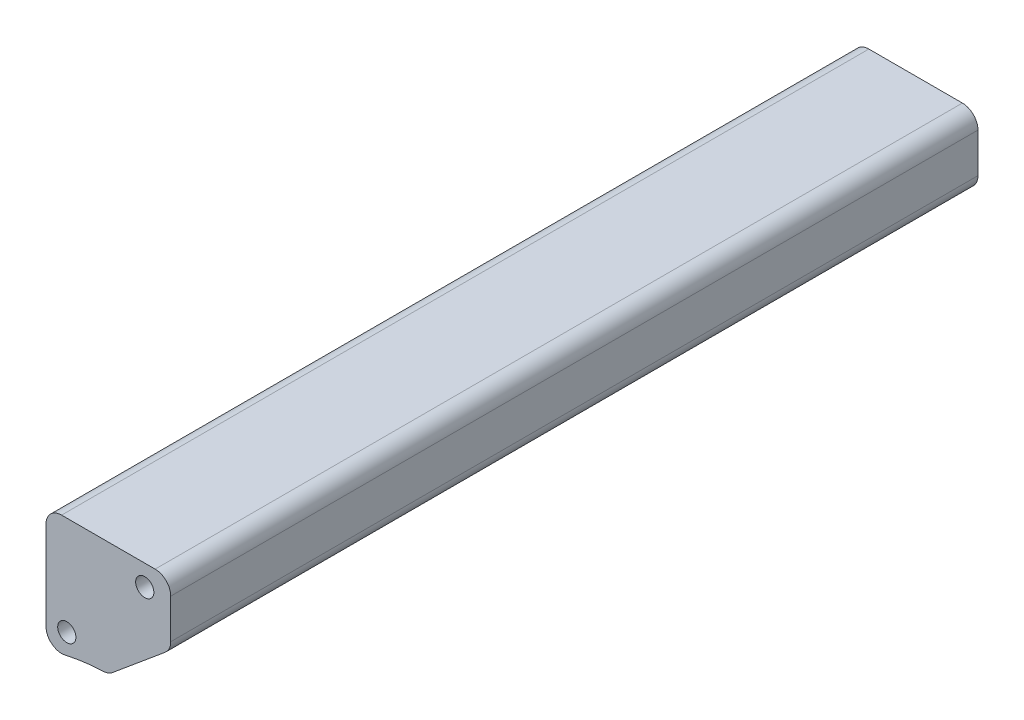
ISO-10303-21;
HEADER;
FILE_DESCRIPTION(('STEP AP214'),'2;1');
FILE_NAME('part.step','',(''),(''),'','','');
FILE_SCHEMA(('AUTOMOTIVE_DESIGN { 1 0 10303 214 1 1 1 1 }'));
ENDSEC;
DATA;
#1=APPLICATION_CONTEXT('core data for automotive mechanical design processes');
#2=APPLICATION_PROTOCOL_DEFINITION('international standard','automotive_design',2000,#1);
#3=PRODUCT_CONTEXT('',#1,'mechanical');
#4=PRODUCT('Part','Part','',(#3));
#5=PRODUCT_RELATED_PRODUCT_CATEGORY('part','',(#4));
#6=PRODUCT_DEFINITION_FORMATION('','',#4);
#7=PRODUCT_DEFINITION_CONTEXT('part definition',#1,'design');
#8=PRODUCT_DEFINITION('design','',#6,#7);
#9=PRODUCT_DEFINITION_SHAPE('','',#8);
#10=(LENGTH_UNIT() NAMED_UNIT(*) SI_UNIT(.MILLI.,.METRE.));
#11=(NAMED_UNIT(*) PLANE_ANGLE_UNIT() SI_UNIT($,.RADIAN.));
#12=(NAMED_UNIT(*) SI_UNIT($,.STERADIAN.) SOLID_ANGLE_UNIT());
#13=UNCERTAINTY_MEASURE_WITH_UNIT(LENGTH_MEASURE(1.E-05),#10,'distance_accuracy_value','');
#14=(GEOMETRIC_REPRESENTATION_CONTEXT(3) GLOBAL_UNCERTAINTY_ASSIGNED_CONTEXT((#13)) GLOBAL_UNIT_ASSIGNED_CONTEXT((#10,
#11,#12)) REPRESENTATION_CONTEXT('',''));
#15=CARTESIAN_POINT('',(0.,0.,0.));
#16=DIRECTION('',(0.,0.,1.));
#17=DIRECTION('',(1.,0.,0.));
#18=AXIS2_PLACEMENT_3D('',#15,#16,#17);
#19=CARTESIAN_POINT('',(6.2449979983984,-19.,77.66));
#20=DIRECTION('',(0.,0.,-1.));
#21=DIRECTION('',(-1.,0.,0.));
#22=AXIS2_PLACEMENT_3D('',#19,#20,#21);
#23=CYLINDRICAL_SURFACE('',#22,20.);
#24=CARTESIAN_POINT('',(6.2449979983984,-19.,0.));
#25=DIRECTION('',(0.,0.,-1.));
#26=DIRECTION('',(-1.,0.,0.));
#27=AXIS2_PLACEMENT_3D('',#24,#25,#26);
#28=CIRCLE('',#27,20.);
#29=CARTESIAN_POINT('',(1.83104637198128,0.506845748086741,0.));
#30=VERTEX_POINT('',#29);
#31=CARTESIAN_POINT('',(5.49666416086263,0.98599500819509,0.));
#32=VERTEX_POINT('',#31);
#33=EDGE_CURVE('E158',#30,#32,#28,.T.);
#34=ORIENTED_EDGE('',*,*,#33,.T.);
#35=DIRECTION('',(0.,0.,-1.));
#36=VECTOR('',#35,1.);
#37=CARTESIAN_POINT('',(5.49666416086263,0.98599500819509,77.66));
#38=LINE('',#37,#36);
#39=CARTESIAN_POINT('',(5.49666416086263,0.98599500819509,77.66));
#40=VERTEX_POINT('',#39);
#41=EDGE_CURVE('E203',#32,#40,#38,.F.);
#42=ORIENTED_EDGE('',*,*,#41,.T.);
#43=CARTESIAN_POINT('',(6.2449979983984,-19.,77.66));
#44=DIRECTION('',(0.,0.,-1.));
#45=DIRECTION('',(-1.,0.,0.));
#46=AXIS2_PLACEMENT_3D('',#43,#44,#45);
#47=CIRCLE('',#46,20.);
#48=CARTESIAN_POINT('',(1.83104637198128,0.506845748086741,77.66));
#49=VERTEX_POINT('',#48);
#50=EDGE_CURVE('E159',#49,#40,#47,.T.);
#51=ORIENTED_EDGE('',*,*,#50,.F.);
#52=DIRECTION('',(0.,0.,-1.));
#53=VECTOR('',#52,1.);
#54=CARTESIAN_POINT('',(1.83104637198128,0.506845748086741,77.66));
#55=LINE('',#54,#53);
#56=EDGE_CURVE('E200',#49,#30,#55,.T.);
#57=ORIENTED_EDGE('',*,*,#56,.T.);
#58=EDGE_LOOP('',(#34,#42,#51,#57));
#59=FACE_BOUND('',#58,.T.);
#60=ADVANCED_FACE('F38',(#59),#23,.F.);
#61=CARTESIAN_POINT('',(12.,6.,77.66));
#62=DIRECTION('',(-0.64029777249604,0.768126788060806,0.));
#63=DIRECTION('',(-0.768126788060806,-0.64029777249604,0.));
#64=AXIS2_PLACEMENT_3D('',#61,#62,#63);
#65=PLANE('',#64);
#66=DIRECTION('',(0.768126788060806,0.64029777249604,0.));
#67=VECTOR('',#66,1.);
#68=CARTESIAN_POINT('',(12.,6.,77.66));
#69=LINE('',#68,#67);
#70=CARTESIAN_POINT('',(6.40098578179151,1.33275445171851,77.66));
#71=VERTEX_POINT('',#70);
#72=CARTESIAN_POINT('',(11.4604466587441,5.55023726822345,77.66));
#73=VERTEX_POINT('',#72);
#74=EDGE_CURVE('E162',#71,#73,#69,.T.);
#75=ORIENTED_EDGE('',*,*,#74,.F.);
#76=DIRECTION('',(0.,0.,-1.));
#77=VECTOR('',#76,1.);
#78=CARTESIAN_POINT('',(6.40098578179151,1.33275445171851,77.66));
#79=LINE('',#78,#77);
#80=CARTESIAN_POINT('',(6.40098578179151,1.33275445171851,0.));
#81=VERTEX_POINT('',#80);
#82=EDGE_CURVE('E187',#71,#81,#79,.T.);
#83=ORIENTED_EDGE('',*,*,#82,.T.);
#84=DIRECTION('',(0.768126788060806,0.64029777249604,0.));
#85=VECTOR('',#84,1.);
#86=CARTESIAN_POINT('',(12.,6.,0.));
#87=LINE('',#86,#85);
#88=CARTESIAN_POINT('',(11.4604466587441,5.55023726822345,0.));
#89=VERTEX_POINT('',#88);
#90=EDGE_CURVE('E176',#81,#89,#87,.T.);
#91=ORIENTED_EDGE('',*,*,#90,.T.);
#92=DIRECTION('',(0.,0.,-1.));
#93=VECTOR('',#92,1.);
#94=CARTESIAN_POINT('',(11.4604466587441,5.55023726822345,77.66));
#95=LINE('',#94,#93);
#96=EDGE_CURVE('E173',#89,#73,#95,.F.);
#97=ORIENTED_EDGE('',*,*,#96,.T.);
#98=EDGE_LOOP('',(#75,#83,#91,#97));
#99=FACE_BOUND('',#98,.T.);
#100=ADVANCED_FACE('F247',(#99),#65,.F.);
#101=CARTESIAN_POINT('',(12.,12.,77.66));
#102=DIRECTION('',(-1.,0.,0.));
#103=DIRECTION('',(0.,-1.,0.));
#104=AXIS2_PLACEMENT_3D('',#101,#102,#103);
#105=PLANE('',#104);
#106=DIRECTION('',(0.,1.,0.));
#107=VECTOR('',#106,1.);
#108=CARTESIAN_POINT('',(12.,12.,77.66));
#109=LINE('',#108,#107);
#110=CARTESIAN_POINT('',(12.,6.70242745031466,77.66));
#111=VERTEX_POINT('',#110);
#112=CARTESIAN_POINT('',(12.,10.5,77.66));
#113=VERTEX_POINT('',#112);
#114=EDGE_CURVE('E166',#111,#113,#109,.T.);
#115=ORIENTED_EDGE('',*,*,#114,.F.);
#116=DIRECTION('',(0.,0.,-1.));
#117=VECTOR('',#116,1.);
#118=CARTESIAN_POINT('',(12.,6.70242745031466,77.66));
#119=LINE('',#118,#117);
#120=CARTESIAN_POINT('',(12.,6.70242745031466,0.));
#121=VERTEX_POINT('',#120);
#122=EDGE_CURVE('E216',#111,#121,#119,.T.);
#123=ORIENTED_EDGE('',*,*,#122,.T.);
#124=DIRECTION('',(0.,1.,0.));
#125=VECTOR('',#124,1.);
#126=CARTESIAN_POINT('',(12.,12.,0.));
#127=LINE('',#126,#125);
#128=CARTESIAN_POINT('',(12.,10.5,0.));
#129=VERTEX_POINT('',#128);
#130=EDGE_CURVE('E179',#121,#129,#127,.T.);
#131=ORIENTED_EDGE('',*,*,#130,.T.);
#132=DIRECTION('',(0.,0.,-1.));
#133=VECTOR('',#132,1.);
#134=CARTESIAN_POINT('',(12.,10.5,77.66));
#135=LINE('',#134,#133);
#136=EDGE_CURVE('E214',#129,#113,#135,.F.);
#137=ORIENTED_EDGE('',*,*,#136,.T.);
#138=EDGE_LOOP('',(#115,#123,#131,#137));
#139=FACE_BOUND('',#138,.T.);
#140=ADVANCED_FACE('F256',(#139),#105,.F.);
#141=CARTESIAN_POINT('',(0.,12.,77.66));
#142=DIRECTION('',(0.,-1.,0.));
#143=DIRECTION('',(0.,0.,-1.));
#144=AXIS2_PLACEMENT_3D('',#141,#142,#143);
#145=PLANE('',#144);
#146=DIRECTION('',(-1.,0.,0.));
#147=VECTOR('',#146,1.);
#148=CARTESIAN_POINT('',(0.,12.,77.66));
#149=LINE('',#148,#147);
#150=CARTESIAN_POINT('',(10.5,12.,77.66));
#151=VERTEX_POINT('',#150);
#152=CARTESIAN_POINT('',(1.5,12.,77.66));
#153=VERTEX_POINT('',#152);
#154=EDGE_CURVE('E169',#151,#153,#149,.T.);
#155=ORIENTED_EDGE('',*,*,#154,.F.);
#156=DIRECTION('',(0.,0.,-1.));
#157=VECTOR('',#156,1.);
#158=CARTESIAN_POINT('',(10.5,12.,77.66));
#159=LINE('',#158,#157);
#160=CARTESIAN_POINT('',(10.5,12.,0.));
#161=VERTEX_POINT('',#160);
#162=EDGE_CURVE('E221',#151,#161,#159,.T.);
#163=ORIENTED_EDGE('',*,*,#162,.T.);
#164=DIRECTION('',(-1.,0.,0.));
#165=VECTOR('',#164,1.);
#166=CARTESIAN_POINT('',(0.,12.,0.));
#167=LINE('',#166,#165);
#168=CARTESIAN_POINT('',(1.5,12.,0.));
#169=VERTEX_POINT('',#168);
#170=EDGE_CURVE('E182',#161,#169,#167,.T.);
#171=ORIENTED_EDGE('',*,*,#170,.T.);
#172=DIRECTION('',(0.,0.,-1.));
#173=VECTOR('',#172,1.);
#174=CARTESIAN_POINT('',(1.5,12.,77.66));
#175=LINE('',#174,#173);
#176=EDGE_CURVE('E219',#169,#153,#175,.F.);
#177=ORIENTED_EDGE('',*,*,#176,.T.);
#178=EDGE_LOOP('',(#155,#163,#171,#177));
#179=FACE_BOUND('',#178,.T.);
#180=ADVANCED_FACE('F264',(#179),#145,.F.);
#181=CARTESIAN_POINT('',(0.,0.,77.66));
#182=DIRECTION('',(1.,0.,0.));
#183=DIRECTION('',(0.,0.,-1.));
#184=AXIS2_PLACEMENT_3D('',#181,#182,#183);
#185=PLANE('',#184);
#186=DIRECTION('',(0.,-1.,0.));
#187=VECTOR('',#186,1.);
#188=CARTESIAN_POINT('',(0.,0.,0.));
#189=LINE('',#188,#187);
#190=CARTESIAN_POINT('',(0.,10.5,0.));
#191=VERTEX_POINT('',#190);
#192=CARTESIAN_POINT('',(0.,1.96985917919325,0.));
#193=VERTEX_POINT('',#192);
#194=EDGE_CURVE('E163',#191,#193,#189,.T.);
#195=ORIENTED_EDGE('',*,*,#194,.T.);
#196=DIRECTION('',(0.,0.,-1.));
#197=VECTOR('',#196,1.);
#198=CARTESIAN_POINT('',(0.,1.96985917919325,77.66));
#199=LINE('',#198,#197);
#200=CARTESIAN_POINT('',(0.,1.96985917919325,77.66));
#201=VERTEX_POINT('',#200);
#202=EDGE_CURVE('E11',#193,#201,#199,.F.);
#203=ORIENTED_EDGE('',*,*,#202,.T.);
#204=DIRECTION('',(0.,-1.,0.));
#205=VECTOR('',#204,1.);
#206=CARTESIAN_POINT('',(0.,0.,77.66));
#207=LINE('',#206,#205);
#208=CARTESIAN_POINT('',(0.,10.5,77.66));
#209=VERTEX_POINT('',#208);
#210=EDGE_CURVE('E171',#209,#201,#207,.T.);
#211=ORIENTED_EDGE('',*,*,#210,.F.);
#212=DIRECTION('',(0.,0.,-1.));
#213=VECTOR('',#212,1.);
#214=CARTESIAN_POINT('',(0.,10.5,77.66));
#215=LINE('',#214,#213);
#216=EDGE_CURVE('E46',#209,#191,#215,.T.);
#217=ORIENTED_EDGE('',*,*,#216,.T.);
#218=EDGE_LOOP('',(#195,#203,#211,#217));
#219=FACE_BOUND('',#218,.T.);
#220=ADVANCED_FACE('F226',(#219),#185,.F.);
#221=CARTESIAN_POINT('',(6.2449979983984,-19.,77.66));
#222=DIRECTION('',(0.,0.,-1.));
#223=DIRECTION('',(-1.,0.,0.));
#224=AXIS2_PLACEMENT_3D('',#221,#222,#223);
#225=PLANE('',#224);
#226=CARTESIAN_POINT('',(2.,2.5,77.66));
#227=DIRECTION('',(0.,0.,1.));
#228=DIRECTION('',(1.,0.,0.));
#229=AXIS2_PLACEMENT_3D('',#226,#227,#228);
#230=CIRCLE('',#229,0.874999999999999);
#231=CARTESIAN_POINT('',(2.875,2.5,77.66));
#232=VERTEX_POINT('',#231);
#233=EDGE_CURVE('E136',#232,#232,#230,.T.);
#234=ORIENTED_EDGE('',*,*,#233,.F.);
#235=EDGE_LOOP('',(#234));
#236=FACE_BOUND('',#235,.T.);
#237=CARTESIAN_POINT('',(9.5,10.,77.66));
#238=DIRECTION('',(0.,0.,1.));
#239=DIRECTION('',(1.,0.,0.));
#240=AXIS2_PLACEMENT_3D('',#237,#238,#239);
#241=CIRCLE('',#240,0.874999999999999);
#242=CARTESIAN_POINT('',(10.375,10.,77.66));
#243=VERTEX_POINT('',#242);
#244=EDGE_CURVE('E135',#243,#243,#241,.T.);
#245=ORIENTED_EDGE('',*,*,#244,.F.);
#246=EDGE_LOOP('',(#245));
#247=FACE_BOUND('',#246,.T.);
#248=ORIENTED_EDGE('',*,*,#50,.T.);
#249=CARTESIAN_POINT('',(5.44053912304745,2.48494463380972,77.66));
#250=DIRECTION('',(0.,0.,-1.));
#251=DIRECTION('',(-1.,0.,0.));
#252=AXIS2_PLACEMENT_3D('',#249,#250,#251);
#253=CIRCLE('',#252,1.5);
#254=EDGE_CURVE('E212',#40,#71,#253,.F.);
#255=ORIENTED_EDGE('',*,*,#254,.T.);
#256=ORIENTED_EDGE('',*,*,#74,.T.);
#257=CARTESIAN_POINT('',(10.5,6.70242745031466,77.66));
#258=DIRECTION('',(0.,0.,-1.));
#259=DIRECTION('',(-1.,0.,0.));
#260=AXIS2_PLACEMENT_3D('',#257,#258,#259);
#261=CIRCLE('',#260,1.5);
#262=EDGE_CURVE('E210',#73,#111,#261,.F.);
#263=ORIENTED_EDGE('',*,*,#262,.T.);
#264=ORIENTED_EDGE('',*,*,#114,.T.);
#265=CARTESIAN_POINT('',(10.5,10.5,77.66));
#266=DIRECTION('',(0.,0.,-1.));
#267=DIRECTION('',(-1.,0.,0.));
#268=AXIS2_PLACEMENT_3D('',#265,#266,#267);
#269=CIRCLE('',#268,1.5);
#270=EDGE_CURVE('E208',#113,#151,#269,.F.);
#271=ORIENTED_EDGE('',*,*,#270,.T.);
#272=ORIENTED_EDGE('',*,*,#154,.T.);
#273=CARTESIAN_POINT('',(1.5,10.5,77.66));
#274=DIRECTION('',(0.,0.,-1.));
#275=DIRECTION('',(-1.,0.,0.));
#276=AXIS2_PLACEMENT_3D('',#273,#274,#275);
#277=CIRCLE('',#276,1.5);
#278=EDGE_CURVE('E58',#153,#209,#277,.F.);
#279=ORIENTED_EDGE('',*,*,#278,.T.);
#280=ORIENTED_EDGE('',*,*,#210,.T.);
#281=CARTESIAN_POINT('',(1.5,1.96985917919325,77.66));
#282=DIRECTION('',(0.,0.,-1.));
#283=DIRECTION('',(-1.,0.,0.));
#284=AXIS2_PLACEMENT_3D('',#281,#282,#283);
#285=CIRCLE('',#284,1.5);
#286=EDGE_CURVE('E206',#201,#49,#285,.F.);
#287=ORIENTED_EDGE('',*,*,#286,.T.);
#288=EDGE_LOOP('',(#248,#255,#256,#263,#264,#271,#272,#279,#280,#287));
#289=FACE_BOUND('',#288,.T.);
#290=ADVANCED_FACE('F241',(#236,#247,#289),#225,.F.);
#291=CARTESIAN_POINT('',(6.2449979983984,-19.,0.));
#292=DIRECTION('',(0.,0.,-1.));
#293=DIRECTION('',(-1.,0.,0.));
#294=AXIS2_PLACEMENT_3D('',#291,#292,#293);
#295=PLANE('',#294);
#296=CARTESIAN_POINT('',(2.,2.5,0.));
#297=DIRECTION('',(0.,0.,-1.));
#298=DIRECTION('',(-1.,0.,0.));
#299=AXIS2_PLACEMENT_3D('',#296,#297,#298);
#300=CIRCLE('',#299,0.874999999999999);
#301=CARTESIAN_POINT('',(1.125,2.5,0.));
#302=VERTEX_POINT('',#301);
#303=EDGE_CURVE('E146',#302,#302,#300,.T.);
#304=ORIENTED_EDGE('',*,*,#303,.F.);
#305=EDGE_LOOP('',(#304));
#306=FACE_BOUND('',#305,.T.);
#307=CARTESIAN_POINT('',(9.5,10.,0.));
#308=DIRECTION('',(0.,0.,-1.));
#309=DIRECTION('',(-1.,0.,0.));
#310=AXIS2_PLACEMENT_3D('',#307,#308,#309);
#311=CIRCLE('',#310,0.874999999999999);
#312=CARTESIAN_POINT('',(8.625,10.,0.));
#313=VERTEX_POINT('',#312);
#314=EDGE_CURVE('E152',#313,#313,#311,.T.);
#315=ORIENTED_EDGE('',*,*,#314,.F.);
#316=EDGE_LOOP('',(#315));
#317=FACE_BOUND('',#316,.T.);
#318=ORIENTED_EDGE('',*,*,#90,.F.);
#319=CARTESIAN_POINT('',(5.44053912304745,2.48494463380972,0.));
#320=DIRECTION('',(0.,0.,-1.));
#321=DIRECTION('',(-1.,0.,0.));
#322=AXIS2_PLACEMENT_3D('',#319,#320,#321);
#323=CIRCLE('',#322,1.5);
#324=EDGE_CURVE('E198',#81,#32,#323,.T.);
#325=ORIENTED_EDGE('',*,*,#324,.T.);
#326=ORIENTED_EDGE('',*,*,#33,.F.);
#327=CARTESIAN_POINT('',(1.5,1.96985917919325,0.));
#328=DIRECTION('',(0.,0.,-1.));
#329=DIRECTION('',(-1.,0.,0.));
#330=AXIS2_PLACEMENT_3D('',#327,#328,#329);
#331=CIRCLE('',#330,1.5);
#332=EDGE_CURVE('E192',#30,#193,#331,.T.);
#333=ORIENTED_EDGE('',*,*,#332,.T.);
#334=ORIENTED_EDGE('',*,*,#194,.F.);
#335=CARTESIAN_POINT('',(1.5,10.5,0.));
#336=DIRECTION('',(0.,0.,-1.));
#337=DIRECTION('',(-1.,0.,0.));
#338=AXIS2_PLACEMENT_3D('',#335,#336,#337);
#339=CIRCLE('',#338,1.5);
#340=EDGE_CURVE('E190',#191,#169,#339,.T.);
#341=ORIENTED_EDGE('',*,*,#340,.T.);
#342=ORIENTED_EDGE('',*,*,#170,.F.);
#343=CARTESIAN_POINT('',(10.5,10.5,0.));
#344=DIRECTION('',(0.,0.,-1.));
#345=DIRECTION('',(-1.,0.,0.));
#346=AXIS2_PLACEMENT_3D('',#343,#344,#345);
#347=CIRCLE('',#346,1.5);
#348=EDGE_CURVE('E194',#161,#129,#347,.T.);
#349=ORIENTED_EDGE('',*,*,#348,.T.);
#350=ORIENTED_EDGE('',*,*,#130,.F.);
#351=CARTESIAN_POINT('',(10.5,6.70242745031466,0.));
#352=DIRECTION('',(0.,0.,-1.));
#353=DIRECTION('',(-1.,0.,0.));
#354=AXIS2_PLACEMENT_3D('',#351,#352,#353);
#355=CIRCLE('',#354,1.5);
#356=EDGE_CURVE('E196',#121,#89,#355,.T.);
#357=ORIENTED_EDGE('',*,*,#356,.T.);
#358=EDGE_LOOP('',(#318,#325,#326,#333,#334,#341,#342,#349,#350,#357));
#359=FACE_BOUND('',#358,.T.);
#360=ADVANCED_FACE('F230',(#306,#317,#359),#295,.T.);
#361=CARTESIAN_POINT('',(9.5,10.,10.));
#362=DIRECTION('',(0.,0.,-1.));
#363=DIRECTION('',(-1.,0.,0.));
#364=AXIS2_PLACEMENT_3D('',#361,#362,#363);
#365=CONICAL_SURFACE('',#364,0.874999999999997,1.02974425867665);
#366=CARTESIAN_POINT('',(9.5,10.,10.5257530416491));
#367=VERTEX_POINT('',#366);
#368=VERTEX_LOOP('',#367);
#369=FACE_BOUND('',#368,.T.);
#370=CARTESIAN_POINT('',(9.5,10.,10.));
#371=DIRECTION('',(0.,0.,-1.));
#372=DIRECTION('',(-1.,0.,0.));
#373=AXIS2_PLACEMENT_3D('',#370,#371,#372);
#374=CIRCLE('',#373,0.874999999999997);
#375=CARTESIAN_POINT('',(8.625,10.,10.));
#376=VERTEX_POINT('',#375);
#377=EDGE_CURVE('E155',#376,#376,#374,.T.);
#378=ORIENTED_EDGE('',*,*,#377,.T.);
#379=EDGE_LOOP('',(#378));
#380=FACE_BOUND('',#379,.T.);
#381=ADVANCED_FACE('F368',(#369,#380),#365,.F.);
#382=CARTESIAN_POINT('',(9.5,10.,0.));
#383=DIRECTION('',(0.,0.,-1.));
#384=DIRECTION('',(-1.,0.,0.));
#385=AXIS2_PLACEMENT_3D('',#382,#383,#384);
#386=CYLINDRICAL_SURFACE('',#385,0.874999999999998);
#387=ORIENTED_EDGE('',*,*,#377,.F.);
#388=EDGE_LOOP('',(#387));
#389=FACE_BOUND('',#388,.T.);
#390=ORIENTED_EDGE('',*,*,#314,.T.);
#391=EDGE_LOOP('',(#390));
#392=FACE_BOUND('',#391,.T.);
#393=ADVANCED_FACE('F359',(#389,#392),#386,.F.);
#394=CARTESIAN_POINT('',(2.,2.5,10.));
#395=DIRECTION('',(0.,0.,-1.));
#396=DIRECTION('',(-1.,0.,0.));
#397=AXIS2_PLACEMENT_3D('',#394,#395,#396);
#398=CONICAL_SURFACE('',#397,0.874999999999997,1.02974425867665);
#399=CARTESIAN_POINT('',(2.,2.5,10.5257530416491));
#400=VERTEX_POINT('',#399);
#401=VERTEX_LOOP('',#400);
#402=FACE_BOUND('',#401,.T.);
#403=CARTESIAN_POINT('',(2.,2.5,10.));
#404=DIRECTION('',(0.,0.,-1.));
#405=DIRECTION('',(-1.,0.,0.));
#406=AXIS2_PLACEMENT_3D('',#403,#404,#405);
#407=CIRCLE('',#406,0.874999999999997);
#408=CARTESIAN_POINT('',(1.125,2.5,10.));
#409=VERTEX_POINT('',#408);
#410=EDGE_CURVE('E149',#409,#409,#407,.T.);
#411=ORIENTED_EDGE('',*,*,#410,.T.);
#412=EDGE_LOOP('',(#411));
#413=FACE_BOUND('',#412,.T.);
#414=ADVANCED_FACE('F349',(#402,#413),#398,.F.);
#415=CARTESIAN_POINT('',(2.,2.5,0.));
#416=DIRECTION('',(0.,0.,-1.));
#417=DIRECTION('',(-1.,0.,0.));
#418=AXIS2_PLACEMENT_3D('',#415,#416,#417);
#419=CYLINDRICAL_SURFACE('',#418,0.874999999999998);
#420=ORIENTED_EDGE('',*,*,#410,.F.);
#421=EDGE_LOOP('',(#420));
#422=FACE_BOUND('',#421,.T.);
#423=ORIENTED_EDGE('',*,*,#303,.T.);
#424=EDGE_LOOP('',(#423));
#425=FACE_BOUND('',#424,.T.);
#426=ADVANCED_FACE('F340',(#422,#425),#419,.F.);
#427=CARTESIAN_POINT('',(9.5,10.,67.66));
#428=DIRECTION('',(0.,0.,1.));
#429=DIRECTION('',(1.,0.,0.));
#430=AXIS2_PLACEMENT_3D('',#427,#428,#429);
#431=CONICAL_SURFACE('',#430,0.874999999999997,1.02974425867665);
#432=CARTESIAN_POINT('',(9.5,10.,67.1342469583509));
#433=VERTEX_POINT('',#432);
#434=VERTEX_LOOP('',#433);
#435=FACE_BOUND('',#434,.T.);
#436=CARTESIAN_POINT('',(9.5,10.,67.66));
#437=DIRECTION('',(0.,0.,1.));
#438=DIRECTION('',(1.,0.,0.));
#439=AXIS2_PLACEMENT_3D('',#436,#437,#438);
#440=CIRCLE('',#439,0.874999999999997);
#441=CARTESIAN_POINT('',(10.375,10.,67.66));
#442=VERTEX_POINT('',#441);
#443=EDGE_CURVE('E139',#442,#442,#440,.T.);
#444=ORIENTED_EDGE('',*,*,#443,.T.);
#445=EDGE_LOOP('',(#444));
#446=FACE_BOUND('',#445,.T.);
#447=ADVANCED_FACE('F330',(#435,#446),#431,.F.);
#448=CARTESIAN_POINT('',(9.5,10.,77.66));
#449=DIRECTION('',(0.,0.,1.));
#450=DIRECTION('',(1.,0.,0.));
#451=AXIS2_PLACEMENT_3D('',#448,#449,#450);
#452=CYLINDRICAL_SURFACE('',#451,0.874999999999998);
#453=ORIENTED_EDGE('',*,*,#443,.F.);
#454=EDGE_LOOP('',(#453));
#455=FACE_BOUND('',#454,.T.);
#456=ORIENTED_EDGE('',*,*,#244,.T.);
#457=EDGE_LOOP('',(#456));
#458=FACE_BOUND('',#457,.T.);
#459=ADVANCED_FACE('F129',(#455,#458),#452,.F.);
#460=CARTESIAN_POINT('',(2.,2.5,67.66));
#461=DIRECTION('',(0.,0.,1.));
#462=DIRECTION('',(1.,0.,0.));
#463=AXIS2_PLACEMENT_3D('',#460,#461,#462);
#464=CONICAL_SURFACE('',#463,0.874999999999997,1.02974425867665);
#465=CARTESIAN_POINT('',(2.,2.5,67.1342469583509));
#466=VERTEX_POINT('',#465);
#467=VERTEX_LOOP('',#466);
#468=FACE_BOUND('',#467,.T.);
#469=CARTESIAN_POINT('',(2.,2.5,67.66));
#470=DIRECTION('',(0.,0.,1.));
#471=DIRECTION('',(1.,0.,0.));
#472=AXIS2_PLACEMENT_3D('',#469,#470,#471);
#473=CIRCLE('',#472,0.874999999999997);
#474=CARTESIAN_POINT('',(2.875,2.5,67.66));
#475=VERTEX_POINT('',#474);
#476=EDGE_CURVE('E133',#475,#475,#473,.T.);
#477=ORIENTED_EDGE('',*,*,#476,.T.);
#478=EDGE_LOOP('',(#477));
#479=FACE_BOUND('',#478,.T.);
#480=ADVANCED_FACE('F125',(#468,#479),#464,.F.);
#481=CARTESIAN_POINT('',(2.,2.5,77.66));
#482=DIRECTION('',(0.,0.,1.));
#483=DIRECTION('',(1.,0.,0.));
#484=AXIS2_PLACEMENT_3D('',#481,#482,#483);
#485=CYLINDRICAL_SURFACE('',#484,0.874999999999998);
#486=ORIENTED_EDGE('',*,*,#476,.F.);
#487=EDGE_LOOP('',(#486));
#488=FACE_BOUND('',#487,.T.);
#489=ORIENTED_EDGE('',*,*,#233,.T.);
#490=EDGE_LOOP('',(#489));
#491=FACE_BOUND('',#490,.T.);
#492=ADVANCED_FACE('F128',(#488,#491),#485,.F.);
#493=CARTESIAN_POINT('',(5.44053912304745,2.48494463380972,77.66));
#494=DIRECTION('',(0.,0.,-1.));
#495=DIRECTION('',(-1.,0.,0.));
#496=AXIS2_PLACEMENT_3D('',#493,#494,#495);
#497=CYLINDRICAL_SURFACE('',#496,1.5);
#498=ORIENTED_EDGE('',*,*,#254,.F.);
#499=ORIENTED_EDGE('',*,*,#41,.F.);
#500=ORIENTED_EDGE('',*,*,#324,.F.);
#501=ORIENTED_EDGE('',*,*,#82,.F.);
#502=EDGE_LOOP('',(#498,#499,#500,#501));
#503=FACE_BOUND('',#502,.T.);
#504=ADVANCED_FACE('F245',(#503),#497,.T.);
#505=CARTESIAN_POINT('',(10.5,6.70242745031466,77.66));
#506=DIRECTION('',(0.,0.,-1.));
#507=DIRECTION('',(-1.,0.,0.));
#508=AXIS2_PLACEMENT_3D('',#505,#506,#507);
#509=CYLINDRICAL_SURFACE('',#508,1.5);
#510=ORIENTED_EDGE('',*,*,#262,.F.);
#511=ORIENTED_EDGE('',*,*,#96,.F.);
#512=ORIENTED_EDGE('',*,*,#356,.F.);
#513=ORIENTED_EDGE('',*,*,#122,.F.);
#514=EDGE_LOOP('',(#510,#511,#512,#513));
#515=FACE_BOUND('',#514,.T.);
#516=ADVANCED_FACE('F253',(#515),#509,.T.);
#517=CARTESIAN_POINT('',(10.5,10.5,77.66));
#518=DIRECTION('',(0.,0.,-1.));
#519=DIRECTION('',(-1.,0.,0.));
#520=AXIS2_PLACEMENT_3D('',#517,#518,#519);
#521=CYLINDRICAL_SURFACE('',#520,1.5);
#522=ORIENTED_EDGE('',*,*,#270,.F.);
#523=ORIENTED_EDGE('',*,*,#136,.F.);
#524=ORIENTED_EDGE('',*,*,#348,.F.);
#525=ORIENTED_EDGE('',*,*,#162,.F.);
#526=EDGE_LOOP('',(#522,#523,#524,#525));
#527=FACE_BOUND('',#526,.T.);
#528=ADVANCED_FACE('F262',(#527),#521,.T.);
#529=CARTESIAN_POINT('',(1.5,1.96985917919325,77.66));
#530=DIRECTION('',(0.,0.,-1.));
#531=DIRECTION('',(-1.,0.,0.));
#532=AXIS2_PLACEMENT_3D('',#529,#530,#531);
#533=CYLINDRICAL_SURFACE('',#532,1.5);
#534=ORIENTED_EDGE('',*,*,#286,.F.);
#535=ORIENTED_EDGE('',*,*,#202,.F.);
#536=ORIENTED_EDGE('',*,*,#332,.F.);
#537=ORIENTED_EDGE('',*,*,#56,.F.);
#538=EDGE_LOOP('',(#534,#535,#536,#537));
#539=FACE_BOUND('',#538,.T.);
#540=ADVANCED_FACE('F236',(#539),#533,.T.);
#541=CARTESIAN_POINT('',(1.5,10.5,77.66));
#542=DIRECTION('',(0.,0.,-1.));
#543=DIRECTION('',(-1.,0.,0.));
#544=AXIS2_PLACEMENT_3D('',#541,#542,#543);
#545=CYLINDRICAL_SURFACE('',#544,1.5);
#546=ORIENTED_EDGE('',*,*,#278,.F.);
#547=ORIENTED_EDGE('',*,*,#176,.F.);
#548=ORIENTED_EDGE('',*,*,#340,.F.);
#549=ORIENTED_EDGE('',*,*,#216,.F.);
#550=EDGE_LOOP('',(#546,#547,#548,#549));
#551=FACE_BOUND('',#550,.T.);
#552=ADVANCED_FACE('F40',(#551),#545,.T.);
#553=CLOSED_SHELL('',(#60,#100,#140,#180,#220,#290,#360,#381,#393,#414,#426,#447,#459,#480,#492,
#504,#516,#528,#540,#552));
#554=MANIFOLD_SOLID_BREP('B2',#553);
#555=ADVANCED_BREP_SHAPE_REPRESENTATION('',(#18,#554),#14);
#556=SHAPE_DEFINITION_REPRESENTATION(#9,#555);
ENDSEC;
END-ISO-10303-21;
